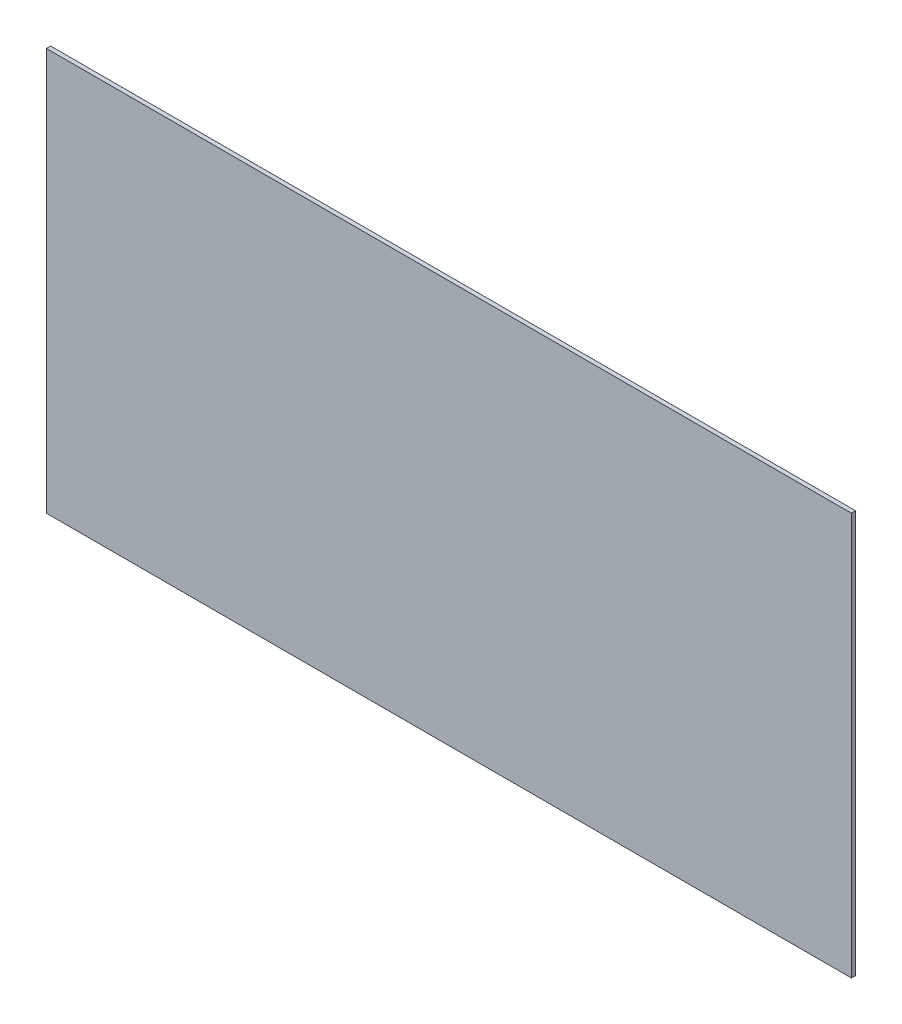
ISO-10303-21;
HEADER;
FILE_DESCRIPTION(('STEP AP214'),'2;1');
FILE_NAME('part.step','',(''),(''),'','','');
FILE_SCHEMA(('AUTOMOTIVE_DESIGN { 1 0 10303 214 1 1 1 1 }'));
ENDSEC;
DATA;
#1=APPLICATION_CONTEXT('core data for automotive mechanical design processes');
#2=APPLICATION_PROTOCOL_DEFINITION('international standard','automotive_design',2000,#1);
#3=PRODUCT_CONTEXT('',#1,'mechanical');
#4=PRODUCT('Part','Part','',(#3));
#5=PRODUCT_RELATED_PRODUCT_CATEGORY('part','',(#4));
#6=PRODUCT_DEFINITION_FORMATION('','',#4);
#7=PRODUCT_DEFINITION_CONTEXT('part definition',#1,'design');
#8=PRODUCT_DEFINITION('design','',#6,#7);
#9=PRODUCT_DEFINITION_SHAPE('','',#8);
#10=(LENGTH_UNIT() NAMED_UNIT(*) SI_UNIT(.MILLI.,.METRE.));
#11=(NAMED_UNIT(*) PLANE_ANGLE_UNIT() SI_UNIT($,.RADIAN.));
#12=(NAMED_UNIT(*) SI_UNIT($,.STERADIAN.) SOLID_ANGLE_UNIT());
#13=UNCERTAINTY_MEASURE_WITH_UNIT(LENGTH_MEASURE(1.E-05),#10,'distance_accuracy_value','');
#14=(GEOMETRIC_REPRESENTATION_CONTEXT(3) GLOBAL_UNCERTAINTY_ASSIGNED_CONTEXT((#13)) GLOBAL_UNIT_ASSIGNED_CONTEXT((#10,
#11,#12)) REPRESENTATION_CONTEXT('',''));
#15=CARTESIAN_POINT('',(0.,0.,0.));
#16=DIRECTION('',(0.,0.,1.));
#17=DIRECTION('',(1.,0.,0.));
#18=AXIS2_PLACEMENT_3D('',#15,#16,#17);
#19=CARTESIAN_POINT('',(0.,0.,6.35));
#20=DIRECTION('',(1.,0.,0.));
#21=DIRECTION('',(0.,0.,-1.));
#22=AXIS2_PLACEMENT_3D('',#19,#20,#21);
#23=PLANE('',#22);
#24=DIRECTION('',(0.,-1.,0.));
#25=VECTOR('',#24,1.);
#26=CARTESIAN_POINT('',(0.,0.,0.));
#27=LINE('',#26,#25);
#28=CARTESIAN_POINT('',(0.,609.6,0.));
#29=VERTEX_POINT('',#28);
#30=CARTESIAN_POINT('',(0.,0.,0.));
#31=VERTEX_POINT('',#30);
#32=EDGE_CURVE('E97',#29,#31,#27,.T.);
#33=ORIENTED_EDGE('',*,*,#32,.T.);
#34=DIRECTION('',(0.,0.,-1.));
#35=VECTOR('',#34,1.);
#36=CARTESIAN_POINT('',(0.,0.,6.35));
#37=LINE('',#36,#35);
#38=CARTESIAN_POINT('',(0.,0.,6.35));
#39=VERTEX_POINT('',#38);
#40=EDGE_CURVE('E11',#39,#31,#37,.T.);
#41=ORIENTED_EDGE('',*,*,#40,.F.);
#42=DIRECTION('',(0.,-1.,0.));
#43=VECTOR('',#42,1.);
#44=CARTESIAN_POINT('',(0.,0.,6.35));
#45=LINE('',#44,#43);
#46=CARTESIAN_POINT('',(0.,609.6,6.35));
#47=VERTEX_POINT('',#46);
#48=EDGE_CURVE('E85',#47,#39,#45,.T.);
#49=ORIENTED_EDGE('',*,*,#48,.F.);
#50=DIRECTION('',(0.,0.,-1.));
#51=VECTOR('',#50,1.);
#52=CARTESIAN_POINT('',(0.,609.6,6.35));
#53=LINE('',#52,#51);
#54=EDGE_CURVE('E93',#47,#29,#53,.T.);
#55=ORIENTED_EDGE('',*,*,#54,.T.);
#56=EDGE_LOOP('',(#33,#41,#49,#55));
#57=FACE_BOUND('',#56,.T.);
#58=ADVANCED_FACE('F34',(#57),#23,.F.);
#59=CARTESIAN_POINT('',(0.,0.,6.35));
#60=DIRECTION('',(0.,1.,0.));
#61=DIRECTION('',(0.,0.,1.));
#62=AXIS2_PLACEMENT_3D('',#59,#60,#61);
#63=PLANE('',#62);
#64=DIRECTION('',(1.,0.,0.));
#65=VECTOR('',#64,1.);
#66=CARTESIAN_POINT('',(0.,0.,0.));
#67=LINE('',#66,#65);
#68=CARTESIAN_POINT('',(1219.2,0.,0.));
#69=VERTEX_POINT('',#68);
#70=EDGE_CURVE('E89',#31,#69,#67,.T.);
#71=ORIENTED_EDGE('',*,*,#70,.T.);
#72=DIRECTION('',(0.,0.,-1.));
#73=VECTOR('',#72,1.);
#74=CARTESIAN_POINT('',(1219.2,0.,6.35));
#75=LINE('',#74,#73);
#76=CARTESIAN_POINT('',(1219.2,0.,6.35));
#77=VERTEX_POINT('',#76);
#78=EDGE_CURVE('E42',#77,#69,#75,.T.);
#79=ORIENTED_EDGE('',*,*,#78,.F.);
#80=DIRECTION('',(1.,0.,0.));
#81=VECTOR('',#80,1.);
#82=CARTESIAN_POINT('',(0.,0.,6.35));
#83=LINE('',#82,#81);
#84=EDGE_CURVE('E80',#39,#77,#83,.T.);
#85=ORIENTED_EDGE('',*,*,#84,.F.);
#86=ORIENTED_EDGE('',*,*,#40,.T.);
#87=EDGE_LOOP('',(#71,#79,#85,#86));
#88=FACE_BOUND('',#87,.T.);
#89=ADVANCED_FACE('F88',(#88),#63,.F.);
#90=CARTESIAN_POINT('',(1219.2,0.,6.35));
#91=DIRECTION('',(-1.,0.,0.));
#92=DIRECTION('',(0.,0.,1.));
#93=AXIS2_PLACEMENT_3D('',#90,#91,#92);
#94=PLANE('',#93);
#95=DIRECTION('',(0.,1.,0.));
#96=VECTOR('',#95,1.);
#97=CARTESIAN_POINT('',(1219.2,0.,0.));
#98=LINE('',#97,#96);
#99=CARTESIAN_POINT('',(1219.2,609.6,0.));
#100=VERTEX_POINT('',#99);
#101=EDGE_CURVE('E67',#69,#100,#98,.T.);
#102=ORIENTED_EDGE('',*,*,#101,.T.);
#103=DIRECTION('',(0.,0.,-1.));
#104=VECTOR('',#103,1.);
#105=CARTESIAN_POINT('',(1219.2,609.6,6.35));
#106=LINE('',#105,#104);
#107=CARTESIAN_POINT('',(1219.2,609.6,6.35));
#108=VERTEX_POINT('',#107);
#109=EDGE_CURVE('E90',#108,#100,#106,.T.);
#110=ORIENTED_EDGE('',*,*,#109,.F.);
#111=DIRECTION('',(0.,1.,0.));
#112=VECTOR('',#111,1.);
#113=CARTESIAN_POINT('',(1219.2,0.,6.35));
#114=LINE('',#113,#112);
#115=EDGE_CURVE('E83',#77,#108,#114,.T.);
#116=ORIENTED_EDGE('',*,*,#115,.F.);
#117=ORIENTED_EDGE('',*,*,#78,.T.);
#118=EDGE_LOOP('',(#102,#110,#116,#117));
#119=FACE_BOUND('',#118,.T.);
#120=ADVANCED_FACE('F91',(#119),#94,.F.);
#121=CARTESIAN_POINT('',(0.,609.6,6.35));
#122=DIRECTION('',(0.,-1.,0.));
#123=DIRECTION('',(0.,0.,-1.));
#124=AXIS2_PLACEMENT_3D('',#121,#122,#123);
#125=PLANE('',#124);
#126=DIRECTION('',(-1.,0.,0.));
#127=VECTOR('',#126,1.);
#128=CARTESIAN_POINT('',(0.,609.6,0.));
#129=LINE('',#128,#127);
#130=EDGE_CURVE('E73',#100,#29,#129,.T.);
#131=ORIENTED_EDGE('',*,*,#130,.T.);
#132=ORIENTED_EDGE('',*,*,#54,.F.);
#133=DIRECTION('',(-1.,0.,0.));
#134=VECTOR('',#133,1.);
#135=CARTESIAN_POINT('',(0.,609.6,6.35));
#136=LINE('',#135,#134);
#137=EDGE_CURVE('E50',#108,#47,#136,.T.);
#138=ORIENTED_EDGE('',*,*,#137,.F.);
#139=ORIENTED_EDGE('',*,*,#109,.T.);
#140=EDGE_LOOP('',(#131,#132,#138,#139));
#141=FACE_BOUND('',#140,.T.);
#142=ADVANCED_FACE('F104',(#141),#125,.F.);
#143=CARTESIAN_POINT('',(0.,0.,6.35));
#144=DIRECTION('',(0.,0.,-1.));
#145=DIRECTION('',(-1.,0.,0.));
#146=AXIS2_PLACEMENT_3D('',#143,#144,#145);
#147=PLANE('',#146);
#148=ORIENTED_EDGE('',*,*,#48,.T.);
#149=ORIENTED_EDGE('',*,*,#84,.T.);
#150=ORIENTED_EDGE('',*,*,#115,.T.);
#151=ORIENTED_EDGE('',*,*,#137,.T.);
#152=EDGE_LOOP('',(#148,#149,#150,#151));
#153=FACE_BOUND('',#152,.T.);
#154=ADVANCED_FACE('F81',(#153),#147,.F.);
#155=CARTESIAN_POINT('',(0.,0.,0.));
#156=DIRECTION('',(0.,0.,-1.));
#157=DIRECTION('',(-1.,0.,0.));
#158=AXIS2_PLACEMENT_3D('',#155,#156,#157);
#159=PLANE('',#158);
#160=ORIENTED_EDGE('',*,*,#32,.F.);
#161=ORIENTED_EDGE('',*,*,#130,.F.);
#162=ORIENTED_EDGE('',*,*,#101,.F.);
#163=ORIENTED_EDGE('',*,*,#70,.F.);
#164=EDGE_LOOP('',(#160,#161,#162,#163));
#165=FACE_BOUND('',#164,.T.);
#166=ADVANCED_FACE('F107',(#165),#159,.T.);
#167=CLOSED_SHELL('',(#58,#89,#120,#142,#154,#166));
#168=MANIFOLD_SOLID_BREP('B2',#167);
#169=ADVANCED_BREP_SHAPE_REPRESENTATION('',(#18,#168),#14);
#170=SHAPE_DEFINITION_REPRESENTATION(#9,#169);
ENDSEC;
END-ISO-10303-21;
